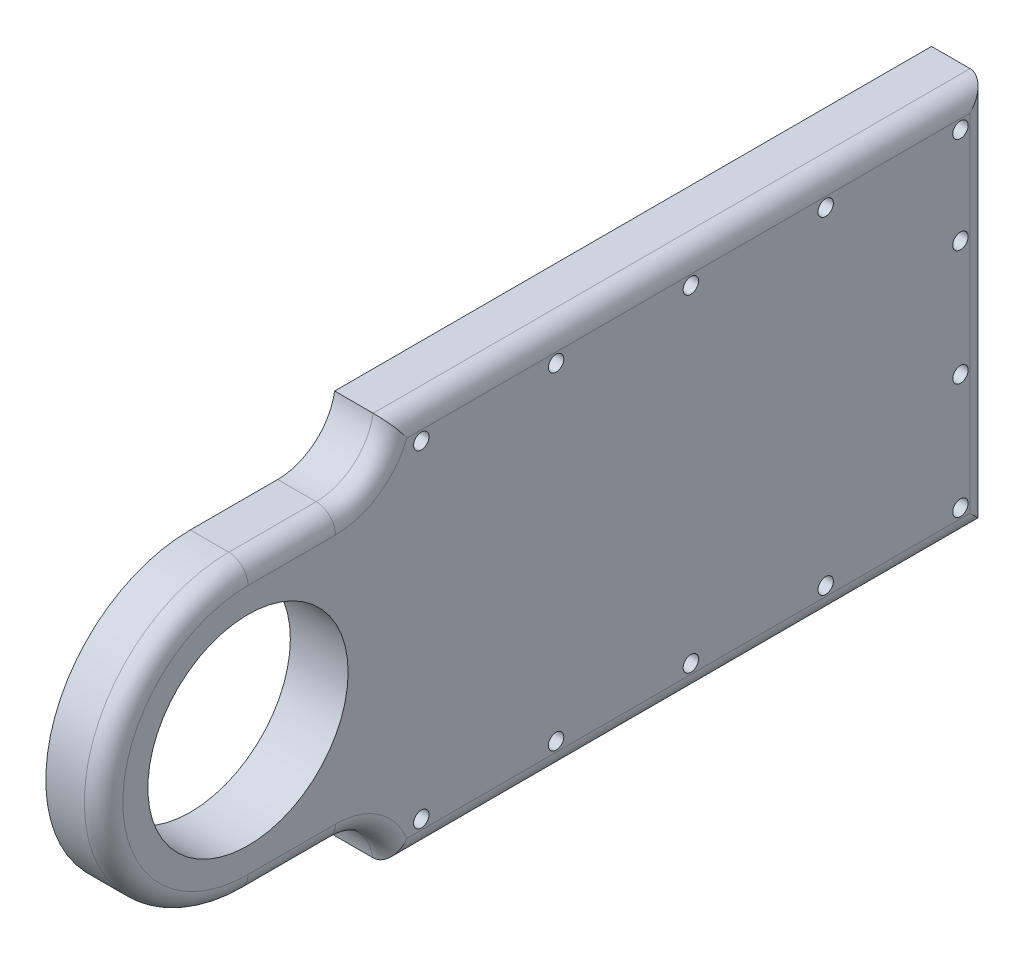
ISO-10303-21;
HEADER;
FILE_DESCRIPTION(('STEP AP214'),'2;1');
FILE_NAME('part.step','',(''),(''),'','','');
FILE_SCHEMA(('AUTOMOTIVE_DESIGN { 1 0 10303 214 1 1 1 1 }'));
ENDSEC;
DATA;
#1=APPLICATION_CONTEXT('core data for automotive mechanical design processes');
#2=APPLICATION_PROTOCOL_DEFINITION('international standard','automotive_design',2000,#1);
#3=PRODUCT_CONTEXT('',#1,'mechanical');
#4=PRODUCT('Part','Part','',(#3));
#5=PRODUCT_RELATED_PRODUCT_CATEGORY('part','',(#4));
#6=PRODUCT_DEFINITION_FORMATION('','',#4);
#7=PRODUCT_DEFINITION_CONTEXT('part definition',#1,'design');
#8=PRODUCT_DEFINITION('design','',#6,#7);
#9=PRODUCT_DEFINITION_SHAPE('','',#8);
#10=(LENGTH_UNIT() NAMED_UNIT(*) SI_UNIT(.MILLI.,.METRE.));
#11=(NAMED_UNIT(*) PLANE_ANGLE_UNIT() SI_UNIT($,.RADIAN.));
#12=(NAMED_UNIT(*) SI_UNIT($,.STERADIAN.) SOLID_ANGLE_UNIT());
#13=UNCERTAINTY_MEASURE_WITH_UNIT(LENGTH_MEASURE(1.E-05),#10,'distance_accuracy_value','');
#14=(GEOMETRIC_REPRESENTATION_CONTEXT(3) GLOBAL_UNCERTAINTY_ASSIGNED_CONTEXT((#13)) GLOBAL_UNIT_ASSIGNED_CONTEXT((#10,
#11,#12)) REPRESENTATION_CONTEXT('',''));
#15=CARTESIAN_POINT('',(0.,0.,0.));
#16=DIRECTION('',(0.,0.,1.));
#17=DIRECTION('',(1.,0.,0.));
#18=AXIS2_PLACEMENT_3D('',#15,#16,#17);
#19=CARTESIAN_POINT('',(0.,12.5,75.));
#20=DIRECTION('',(0.,1.,0.));
#21=DIRECTION('',(0.,0.,1.));
#22=AXIS2_PLACEMENT_3D('',#19,#20,#21);
#23=PLANE('',#22);
#24=DIRECTION('',(1.,0.,0.));
#25=VECTOR('',#24,1.);
#26=CARTESIAN_POINT('',(0.,12.5,14.790199457749));
#27=LINE('',#26,#25);
#28=CARTESIAN_POINT('',(0.,12.5,14.790199457749));
#29=VERTEX_POINT('',#28);
#30=CARTESIAN_POINT('',(10.,12.5,14.790199457749));
#31=VERTEX_POINT('',#30);
#32=EDGE_CURVE('E149',#29,#31,#27,.T.);
#33=ORIENTED_EDGE('',*,*,#32,.T.);
#34=DIRECTION('',(0.,0.,-1.));
#35=VECTOR('',#34,1.);
#36=CARTESIAN_POINT('',(10.,12.5,75.));
#37=LINE('',#36,#35);
#38=CARTESIAN_POINT('',(10.,12.5,37.5000036991946));
#39=VERTEX_POINT('',#38);
#40=EDGE_CURVE('E214',#31,#39,#37,.F.);
#41=ORIENTED_EDGE('',*,*,#40,.T.);
#42=DIRECTION('',(-1.,0.,0.));
#43=VECTOR('',#42,1.);
#44=CARTESIAN_POINT('',(15.,12.5,37.5000036991946));
#45=LINE('',#44,#43);
#46=CARTESIAN_POINT('',(0.,12.5,37.5));
#47=VERTEX_POINT('',#46);
#48=EDGE_CURVE('E441',#39,#47,#45,.T.);
#49=ORIENTED_EDGE('',*,*,#48,.T.);
#50=DIRECTION('',(0.,0.,-1.));
#51=VECTOR('',#50,1.);
#52=CARTESIAN_POINT('',(0.,12.5,75.));
#53=LINE('',#52,#51);
#54=EDGE_CURVE('E455',#47,#29,#53,.T.);
#55=ORIENTED_EDGE('',*,*,#54,.T.);
#56=EDGE_LOOP('',(#33,#41,#49,#55));
#57=FACE_BOUND('',#56,.T.);
#58=ADVANCED_FACE('F43',(#57),#23,.F.);
#59=CARTESIAN_POINT('',(15.,0.,0.));
#60=DIRECTION('',(0.,1.,0.));
#61=DIRECTION('',(0.,0.,1.));
#62=AXIS2_PLACEMENT_3D('',#59,#60,#61);
#63=PLANE('',#62);
#64=DIRECTION('',(-1.,0.,0.));
#65=VECTOR('',#64,1.);
#66=CARTESIAN_POINT('',(15.,0.,-155.));
#67=LINE('',#66,#65);
#68=CARTESIAN_POINT('',(10.,0.,-155.));
#69=VERTEX_POINT('',#68);
#70=CARTESIAN_POINT('',(0.,0.,-155.));
#71=VERTEX_POINT('',#70);
#72=EDGE_CURVE('E150',#69,#71,#67,.T.);
#73=ORIENTED_EDGE('',*,*,#72,.F.);
#74=DIRECTION('',(0.,0.,-1.));
#75=VECTOR('',#74,1.);
#76=CARTESIAN_POINT('',(10.,0.,0.));
#77=LINE('',#76,#75);
#78=CARTESIAN_POINT('',(10.,0.,0.));
#79=VERTEX_POINT('',#78);
#80=EDGE_CURVE('E144',#69,#79,#77,.F.);
#81=ORIENTED_EDGE('',*,*,#80,.T.);
#82=DIRECTION('',(-1.,0.,0.));
#83=VECTOR('',#82,1.);
#84=CARTESIAN_POINT('',(15.,0.,0.));
#85=LINE('',#84,#83);
#86=CARTESIAN_POINT('',(0.,0.,0.));
#87=VERTEX_POINT('',#86);
#88=EDGE_CURVE('E138',#79,#87,#85,.T.);
#89=ORIENTED_EDGE('',*,*,#88,.T.);
#90=DIRECTION('',(0.,0.,-1.));
#91=VECTOR('',#90,1.);
#92=CARTESIAN_POINT('',(0.,0.,0.));
#93=LINE('',#92,#91);
#94=EDGE_CURVE('E141',#87,#71,#93,.T.);
#95=ORIENTED_EDGE('',*,*,#94,.T.);
#96=EDGE_LOOP('',(#73,#81,#89,#95));
#97=FACE_BOUND('',#96,.T.);
#98=ADVANCED_FACE('F140',(#97),#63,.F.);
#99=CARTESIAN_POINT('',(15.,0.,-155.));
#100=DIRECTION('',(0.,0.,1.));
#101=DIRECTION('',(1.,0.,0.));
#102=AXIS2_PLACEMENT_3D('',#99,#100,#101);
#103=PLANE('',#102);
#104=DIRECTION('',(-1.,0.,0.));
#105=VECTOR('',#104,1.);
#106=CARTESIAN_POINT('',(15.,100.,-155.));
#107=LINE('',#106,#105);
#108=CARTESIAN_POINT('',(10.,100.,-155.));
#109=VERTEX_POINT('',#108);
#110=CARTESIAN_POINT('',(0.,100.,-155.));
#111=VERTEX_POINT('',#110);
#112=EDGE_CURVE('E469',#109,#111,#107,.T.);
#113=ORIENTED_EDGE('',*,*,#112,.F.);
#114=DIRECTION('',(0.,1.,0.));
#115=VECTOR('',#114,1.);
#116=CARTESIAN_POINT('',(10.,0.,-155.));
#117=LINE('',#116,#115);
#118=EDGE_CURVE('E58',#109,#69,#117,.F.);
#119=ORIENTED_EDGE('',*,*,#118,.T.);
#120=ORIENTED_EDGE('',*,*,#72,.T.);
#121=DIRECTION('',(0.,1.,0.));
#122=VECTOR('',#121,1.);
#123=CARTESIAN_POINT('',(0.,0.,-155.));
#124=LINE('',#123,#122);
#125=EDGE_CURVE('E161',#71,#111,#124,.T.);
#126=ORIENTED_EDGE('',*,*,#125,.T.);
#127=EDGE_LOOP('',(#113,#119,#120,#126));
#128=FACE_BOUND('',#127,.T.);
#129=ADVANCED_FACE('F281',(#128),#103,.F.);
#130=CARTESIAN_POINT('',(15.,100.,0.));
#131=DIRECTION('',(0.,-1.,0.));
#132=DIRECTION('',(0.,0.,-1.));
#133=AXIS2_PLACEMENT_3D('',#130,#131,#132);
#134=PLANE('',#133);
#135=DIRECTION('',(-1.,0.,0.));
#136=VECTOR('',#135,1.);
#137=CARTESIAN_POINT('',(15.,100.,0.));
#138=LINE('',#137,#136);
#139=CARTESIAN_POINT('',(10.,100.,0.));
#140=VERTEX_POINT('',#139);
#141=CARTESIAN_POINT('',(0.,100.,0.));
#142=VERTEX_POINT('',#141);
#143=EDGE_CURVE('E466',#140,#142,#138,.T.);
#144=ORIENTED_EDGE('',*,*,#143,.F.);
#145=DIRECTION('',(0.,0.,1.));
#146=VECTOR('',#145,1.);
#147=CARTESIAN_POINT('',(10.,100.,0.));
#148=LINE('',#147,#146);
#149=EDGE_CURVE('E11',#140,#109,#148,.F.);
#150=ORIENTED_EDGE('',*,*,#149,.T.);
#151=ORIENTED_EDGE('',*,*,#112,.T.);
#152=DIRECTION('',(0.,0.,1.));
#153=VECTOR('',#152,1.);
#154=CARTESIAN_POINT('',(0.,100.,0.));
#155=LINE('',#154,#153);
#156=EDGE_CURVE('E462',#111,#142,#155,.T.);
#157=ORIENTED_EDGE('',*,*,#156,.T.);
#158=EDGE_LOOP('',(#144,#150,#151,#157));
#159=FACE_BOUND('',#158,.T.);
#160=ADVANCED_FACE('F294',(#159),#134,.F.);
#161=CARTESIAN_POINT('',(15.,0.,0.));
#162=DIRECTION('',(-1.,0.,0.));
#163=DIRECTION('',(0.,0.,1.));
#164=AXIS2_PLACEMENT_3D('',#161,#162,#163);
#165=PLANE('',#164);
#166=DIRECTION('',(0.,0.,-1.));
#167=VECTOR('',#166,1.);
#168=CARTESIAN_POINT('',(15.,82.5,0.));
#169=LINE('',#168,#167);
#170=CARTESIAN_POINT('',(15.,82.5,14.790199457749));
#171=VERTEX_POINT('',#170);
#172=CARTESIAN_POINT('',(15.,82.5,37.5000036991946));
#173=VERTEX_POINT('',#172);
#174=EDGE_CURVE('E198',#171,#173,#169,.F.);
#175=ORIENTED_EDGE('',*,*,#174,.T.);
#176=CARTESIAN_POINT('',(15.,50.,37.5));
#177=DIRECTION('',(-1.,0.,0.));
#178=DIRECTION('',(0.,0.,1.));
#179=AXIS2_PLACEMENT_3D('',#176,#177,#178);
#180=CIRCLE('',#179,32.5000000000002);
#181=CARTESIAN_POINT('',(15.,17.5,37.5000036991946));
#182=VERTEX_POINT('',#181);
#183=EDGE_CURVE('E201',#173,#182,#180,.F.);
#184=ORIENTED_EDGE('',*,*,#183,.T.);
#185=DIRECTION('',(0.,0.,-1.));
#186=VECTOR('',#185,1.);
#187=CARTESIAN_POINT('',(15.,17.5,0.));
#188=LINE('',#187,#186);
#189=CARTESIAN_POINT('',(15.,17.5,14.790199457749));
#190=VERTEX_POINT('',#189);
#191=EDGE_CURVE('E195',#182,#190,#188,.T.);
#192=ORIENTED_EDGE('',*,*,#191,.T.);
#193=CARTESIAN_POINT('',(15.,-2.49999999999999,14.790199457749));
#194=DIRECTION('',(-1.,0.,0.));
#195=DIRECTION('',(0.,0.,1.));
#196=AXIS2_PLACEMENT_3D('',#193,#194,#195);
#197=CIRCLE('',#196,20.);
#198=CARTESIAN_POINT('',(15.,5.,-3.75029675999012));
#199=VERTEX_POINT('',#198);
#200=EDGE_CURVE('E188',#190,#199,#197,.T.);
#201=ORIENTED_EDGE('',*,*,#200,.T.);
#202=DIRECTION('',(0.,0.,-1.));
#203=VECTOR('',#202,1.);
#204=CARTESIAN_POINT('',(15.,5.,0.));
#205=LINE('',#204,#203);
#206=CARTESIAN_POINT('',(15.,5.,-150.));
#207=VERTEX_POINT('',#206);
#208=EDGE_CURVE('E185',#199,#207,#205,.T.);
#209=ORIENTED_EDGE('',*,*,#208,.T.);
#210=DIRECTION('',(0.,1.,0.));
#211=VECTOR('',#210,1.);
#212=CARTESIAN_POINT('',(15.,0.,-150.));
#213=LINE('',#212,#211);
#214=CARTESIAN_POINT('',(15.,95.,-150.));
#215=VERTEX_POINT('',#214);
#216=EDGE_CURVE('E182',#207,#215,#213,.T.);
#217=ORIENTED_EDGE('',*,*,#216,.T.);
#218=DIRECTION('',(0.,0.,1.));
#219=VECTOR('',#218,1.);
#220=CARTESIAN_POINT('',(15.,95.,0.));
#221=LINE('',#220,#219);
#222=CARTESIAN_POINT('',(15.,95.,-3.75029675999012));
#223=VERTEX_POINT('',#222);
#224=EDGE_CURVE('E175',#215,#223,#221,.T.);
#225=ORIENTED_EDGE('',*,*,#224,.T.);
#226=CARTESIAN_POINT('',(15.,102.5,14.790199457749));
#227=DIRECTION('',(-1.,0.,0.));
#228=DIRECTION('',(0.,0.,1.));
#229=AXIS2_PLACEMENT_3D('',#226,#227,#228);
#230=CIRCLE('',#229,20.);
#231=EDGE_CURVE('E191',#223,#171,#230,.T.);
#232=ORIENTED_EDGE('',*,*,#231,.T.);
#233=EDGE_LOOP('',(#175,#184,#192,#201,#209,#217,#225,#232));
#234=FACE_BOUND('',#233,.T.);
#235=CARTESIAN_POINT('',(15.,92.5,-112.5));
#236=DIRECTION('',(-1.,0.,0.));
#237=DIRECTION('',(0.,0.,1.));
#238=AXIS2_PLACEMENT_3D('',#235,#236,#237);
#239=CIRCLE('',#238,2.);
#240=CARTESIAN_POINT('',(15.,92.5,-110.5));
#241=VERTEX_POINT('',#240);
#242=EDGE_CURVE('E392',#241,#241,#239,.T.);
#243=ORIENTED_EDGE('',*,*,#242,.T.);
#244=EDGE_LOOP('',(#243));
#245=FACE_BOUND('',#244,.T.);
#246=CARTESIAN_POINT('',(15.,67.5,-147.5));
#247=DIRECTION('',(-1.,0.,0.));
#248=DIRECTION('',(0.,0.,-1.));
#249=AXIS2_PLACEMENT_3D('',#246,#247,#248);
#250=CIRCLE('',#249,2.);
#251=CARTESIAN_POINT('',(15.,67.5,-149.5));
#252=VERTEX_POINT('',#251);
#253=EDGE_CURVE('E384',#252,#252,#250,.T.);
#254=ORIENTED_EDGE('',*,*,#253,.T.);
#255=EDGE_LOOP('',(#254));
#256=FACE_BOUND('',#255,.T.);
#257=CARTESIAN_POINT('',(15.,37.5,-147.5));
#258=DIRECTION('',(-1.,0.,0.));
#259=DIRECTION('',(0.,0.,-1.));
#260=AXIS2_PLACEMENT_3D('',#257,#258,#259);
#261=CIRCLE('',#260,2.);
#262=CARTESIAN_POINT('',(15.,37.5,-149.5));
#263=VERTEX_POINT('',#262);
#264=EDGE_CURVE('E376',#263,#263,#261,.T.);
#265=ORIENTED_EDGE('',*,*,#264,.T.);
#266=EDGE_LOOP('',(#265));
#267=FACE_BOUND('',#266,.T.);
#268=CARTESIAN_POINT('',(15.,7.50000000000001,-147.5));
#269=DIRECTION('',(-1.,0.,0.));
#270=DIRECTION('',(0.,0.,-1.));
#271=AXIS2_PLACEMENT_3D('',#268,#269,#270);
#272=CIRCLE('',#271,2.);
#273=CARTESIAN_POINT('',(15.,7.50000000000001,-149.5));
#274=VERTEX_POINT('',#273);
#275=EDGE_CURVE('E367',#274,#274,#272,.T.);
#276=ORIENTED_EDGE('',*,*,#275,.T.);
#277=EDGE_LOOP('',(#276));
#278=FACE_BOUND('',#277,.T.);
#279=CARTESIAN_POINT('',(15.,7.50000000000001,-112.5));
#280=DIRECTION('',(-1.,0.,0.));
#281=DIRECTION('',(0.,0.,-1.));
#282=AXIS2_PLACEMENT_3D('',#279,#280,#281);
#283=CIRCLE('',#282,2.);
#284=CARTESIAN_POINT('',(15.,7.50000000000001,-114.5));
#285=VERTEX_POINT('',#284);
#286=EDGE_CURVE('E426',#285,#285,#283,.T.);
#287=ORIENTED_EDGE('',*,*,#286,.T.);
#288=EDGE_LOOP('',(#287));
#289=FACE_BOUND('',#288,.T.);
#290=CARTESIAN_POINT('',(15.,7.50000000000001,-77.5));
#291=DIRECTION('',(-1.,0.,0.));
#292=DIRECTION('',(0.,0.,-1.));
#293=AXIS2_PLACEMENT_3D('',#290,#291,#292);
#294=CIRCLE('',#293,2.);
#295=CARTESIAN_POINT('',(15.,7.50000000000001,-79.5));
#296=VERTEX_POINT('',#295);
#297=EDGE_CURVE('E418',#296,#296,#294,.T.);
#298=ORIENTED_EDGE('',*,*,#297,.T.);
#299=EDGE_LOOP('',(#298));
#300=FACE_BOUND('',#299,.T.);
#301=CARTESIAN_POINT('',(15.,7.50000000000001,-42.5));
#302=DIRECTION('',(-1.,0.,0.));
#303=DIRECTION('',(0.,0.,-1.));
#304=AXIS2_PLACEMENT_3D('',#301,#302,#303);
#305=CIRCLE('',#304,2.);
#306=CARTESIAN_POINT('',(15.,7.50000000000001,-44.5));
#307=VERTEX_POINT('',#306);
#308=EDGE_CURVE('E410',#307,#307,#305,.T.);
#309=ORIENTED_EDGE('',*,*,#308,.T.);
#310=EDGE_LOOP('',(#309));
#311=FACE_BOUND('',#310,.T.);
#312=CARTESIAN_POINT('',(15.,7.50000000000001,-7.50000000000009));
#313=DIRECTION('',(-1.,0.,0.));
#314=DIRECTION('',(0.,0.,-1.));
#315=AXIS2_PLACEMENT_3D('',#312,#313,#314);
#316=CIRCLE('',#315,2.);
#317=CARTESIAN_POINT('',(15.,7.50000000000001,-9.50000000000009));
#318=VERTEX_POINT('',#317);
#319=EDGE_CURVE('E401',#318,#318,#316,.T.);
#320=ORIENTED_EDGE('',*,*,#319,.T.);
#321=EDGE_LOOP('',(#320));
#322=FACE_BOUND('',#321,.T.);
#323=CARTESIAN_POINT('',(15.,92.5,-77.5));
#324=DIRECTION('',(-1.,0.,0.));
#325=DIRECTION('',(0.,0.,1.));
#326=AXIS2_PLACEMENT_3D('',#323,#324,#325);
#327=CIRCLE('',#326,2.);
#328=CARTESIAN_POINT('',(15.,92.5,-75.5));
#329=VERTEX_POINT('',#328);
#330=EDGE_CURVE('E400',#329,#329,#327,.T.);
#331=ORIENTED_EDGE('',*,*,#330,.T.);
#332=EDGE_LOOP('',(#331));
#333=FACE_BOUND('',#332,.T.);
#334=CARTESIAN_POINT('',(15.,92.5,-42.5));
#335=DIRECTION('',(-1.,0.,0.));
#336=DIRECTION('',(0.,0.,1.));
#337=AXIS2_PLACEMENT_3D('',#334,#335,#336);
#338=CIRCLE('',#337,2.);
#339=CARTESIAN_POINT('',(15.,92.5,-40.5));
#340=VERTEX_POINT('',#339);
#341=EDGE_CURVE('E537',#340,#340,#338,.T.);
#342=ORIENTED_EDGE('',*,*,#341,.T.);
#343=EDGE_LOOP('',(#342));
#344=FACE_BOUND('',#343,.T.);
#345=CARTESIAN_POINT('',(15.,92.5,-7.49999999999998));
#346=DIRECTION('',(-1.,0.,0.));
#347=DIRECTION('',(0.,0.,1.));
#348=AXIS2_PLACEMENT_3D('',#345,#346,#347);
#349=CIRCLE('',#348,2.);
#350=CARTESIAN_POINT('',(15.,92.5,-5.49999999999998));
#351=VERTEX_POINT('',#350);
#352=EDGE_CURVE('E357',#351,#351,#349,.T.);
#353=ORIENTED_EDGE('',*,*,#352,.T.);
#354=EDGE_LOOP('',(#353));
#355=FACE_BOUND('',#354,.T.);
#356=CARTESIAN_POINT('',(15.,92.5,-147.5));
#357=DIRECTION('',(-1.,0.,0.));
#358=DIRECTION('',(0.,0.,1.));
#359=AXIS2_PLACEMENT_3D('',#356,#357,#358);
#360=CIRCLE('',#359,2.);
#361=CARTESIAN_POINT('',(15.,92.5,-145.5));
#362=VERTEX_POINT('',#361);
#363=EDGE_CURVE('E433',#362,#362,#360,.T.);
#364=ORIENTED_EDGE('',*,*,#363,.T.);
#365=EDGE_LOOP('',(#364));
#366=FACE_BOUND('',#365,.T.);
#367=CARTESIAN_POINT('',(15.,50.,37.5));
#368=DIRECTION('',(1.,0.,0.));
#369=DIRECTION('',(0.,0.,-1.));
#370=AXIS2_PLACEMENT_3D('',#367,#368,#369);
#371=CIRCLE('',#370,26.);
#372=CARTESIAN_POINT('',(15.,50.,11.5));
#373=VERTEX_POINT('',#372);
#374=EDGE_CURVE('E450',#373,#373,#371,.T.);
#375=ORIENTED_EDGE('',*,*,#374,.F.);
#376=EDGE_LOOP('',(#375));
#377=FACE_BOUND('',#376,.T.);
#378=ADVANCED_FACE('F291',(#234,#245,#256,#267,#278,#289,#300,#311,#322,#333,#344,#355,#366,
#377),#165,.F.);
#379=CARTESIAN_POINT('',(0.,0.,0.));
#380=DIRECTION('',(-1.,0.,0.));
#381=DIRECTION('',(0.,0.,1.));
#382=AXIS2_PLACEMENT_3D('',#379,#380,#381);
#383=PLANE('',#382);
#384=CARTESIAN_POINT('',(0.,92.5,-112.5));
#385=DIRECTION('',(-1.,0.,0.));
#386=DIRECTION('',(0.,0.,1.));
#387=AXIS2_PLACEMENT_3D('',#384,#385,#386);
#388=CIRCLE('',#387,2.);
#389=CARTESIAN_POINT('',(0.,92.5,-110.5));
#390=VERTEX_POINT('',#389);
#391=EDGE_CURVE('E396',#390,#390,#388,.T.);
#392=ORIENTED_EDGE('',*,*,#391,.F.);
#393=EDGE_LOOP('',(#392));
#394=FACE_BOUND('',#393,.T.);
#395=CARTESIAN_POINT('',(0.,67.5,-147.5));
#396=DIRECTION('',(-1.,0.,0.));
#397=DIRECTION('',(0.,0.,-1.));
#398=AXIS2_PLACEMENT_3D('',#395,#396,#397);
#399=CIRCLE('',#398,2.);
#400=CARTESIAN_POINT('',(0.,67.5,-149.5));
#401=VERTEX_POINT('',#400);
#402=EDGE_CURVE('E388',#401,#401,#399,.T.);
#403=ORIENTED_EDGE('',*,*,#402,.F.);
#404=EDGE_LOOP('',(#403));
#405=FACE_BOUND('',#404,.T.);
#406=CARTESIAN_POINT('',(0.,37.5,-147.5));
#407=DIRECTION('',(-1.,0.,0.));
#408=DIRECTION('',(0.,0.,-1.));
#409=AXIS2_PLACEMENT_3D('',#406,#407,#408);
#410=CIRCLE('',#409,2.);
#411=CARTESIAN_POINT('',(0.,37.5,-149.5));
#412=VERTEX_POINT('',#411);
#413=EDGE_CURVE('E380',#412,#412,#410,.T.);
#414=ORIENTED_EDGE('',*,*,#413,.F.);
#415=EDGE_LOOP('',(#414));
#416=FACE_BOUND('',#415,.T.);
#417=CARTESIAN_POINT('',(0.,7.50000000000001,-147.5));
#418=DIRECTION('',(-1.,0.,0.));
#419=DIRECTION('',(0.,0.,-1.));
#420=AXIS2_PLACEMENT_3D('',#417,#418,#419);
#421=CIRCLE('',#420,2.);
#422=CARTESIAN_POINT('',(0.,7.50000000000001,-149.5));
#423=VERTEX_POINT('',#422);
#424=EDGE_CURVE('E372',#423,#423,#421,.T.);
#425=ORIENTED_EDGE('',*,*,#424,.F.);
#426=EDGE_LOOP('',(#425));
#427=FACE_BOUND('',#426,.T.);
#428=CARTESIAN_POINT('',(0.,7.50000000000001,-112.5));
#429=DIRECTION('',(-1.,0.,0.));
#430=DIRECTION('',(0.,0.,-1.));
#431=AXIS2_PLACEMENT_3D('',#428,#429,#430);
#432=CIRCLE('',#431,2.);
#433=CARTESIAN_POINT('',(0.,7.50000000000001,-114.5));
#434=VERTEX_POINT('',#433);
#435=EDGE_CURVE('E371',#434,#434,#432,.T.);
#436=ORIENTED_EDGE('',*,*,#435,.F.);
#437=EDGE_LOOP('',(#436));
#438=FACE_BOUND('',#437,.T.);
#439=CARTESIAN_POINT('',(0.,7.50000000000001,-77.5));
#440=DIRECTION('',(-1.,0.,0.));
#441=DIRECTION('',(0.,0.,-1.));
#442=AXIS2_PLACEMENT_3D('',#439,#440,#441);
#443=CIRCLE('',#442,2.);
#444=CARTESIAN_POINT('',(0.,7.50000000000001,-79.5));
#445=VERTEX_POINT('',#444);
#446=EDGE_CURVE('E422',#445,#445,#443,.T.);
#447=ORIENTED_EDGE('',*,*,#446,.F.);
#448=EDGE_LOOP('',(#447));
#449=FACE_BOUND('',#448,.T.);
#450=CARTESIAN_POINT('',(0.,7.50000000000001,-42.5));
#451=DIRECTION('',(-1.,0.,0.));
#452=DIRECTION('',(0.,0.,-1.));
#453=AXIS2_PLACEMENT_3D('',#450,#451,#452);
#454=CIRCLE('',#453,2.);
#455=CARTESIAN_POINT('',(0.,7.50000000000001,-44.5));
#456=VERTEX_POINT('',#455);
#457=EDGE_CURVE('E414',#456,#456,#454,.T.);
#458=ORIENTED_EDGE('',*,*,#457,.F.);
#459=EDGE_LOOP('',(#458));
#460=FACE_BOUND('',#459,.T.);
#461=CARTESIAN_POINT('',(0.,7.50000000000001,-7.50000000000009));
#462=DIRECTION('',(-1.,0.,0.));
#463=DIRECTION('',(0.,0.,-1.));
#464=AXIS2_PLACEMENT_3D('',#461,#462,#463);
#465=CIRCLE('',#464,2.);
#466=CARTESIAN_POINT('',(0.,7.50000000000001,-9.50000000000009));
#467=VERTEX_POINT('',#466);
#468=EDGE_CURVE('E406',#467,#467,#465,.T.);
#469=ORIENTED_EDGE('',*,*,#468,.F.);
#470=EDGE_LOOP('',(#469));
#471=FACE_BOUND('',#470,.T.);
#472=CARTESIAN_POINT('',(0.,92.5,-77.5));
#473=DIRECTION('',(-1.,0.,0.));
#474=DIRECTION('',(0.,0.,1.));
#475=AXIS2_PLACEMENT_3D('',#472,#473,#474);
#476=CIRCLE('',#475,2.);
#477=CARTESIAN_POINT('',(0.,92.5,-75.5));
#478=VERTEX_POINT('',#477);
#479=EDGE_CURVE('E534',#478,#478,#476,.T.);
#480=ORIENTED_EDGE('',*,*,#479,.F.);
#481=EDGE_LOOP('',(#480));
#482=FACE_BOUND('',#481,.T.);
#483=CARTESIAN_POINT('',(0.,92.5,-42.5));
#484=DIRECTION('',(-1.,0.,0.));
#485=DIRECTION('',(0.,0.,1.));
#486=AXIS2_PLACEMENT_3D('',#483,#484,#485);
#487=CIRCLE('',#486,2.);
#488=CARTESIAN_POINT('',(0.,92.5,-40.5));
#489=VERTEX_POINT('',#488);
#490=EDGE_CURVE('E363',#489,#489,#487,.T.);
#491=ORIENTED_EDGE('',*,*,#490,.F.);
#492=EDGE_LOOP('',(#491));
#493=FACE_BOUND('',#492,.T.);
#494=CARTESIAN_POINT('',(0.,92.5,-7.49999999999998));
#495=DIRECTION('',(-1.,0.,0.));
#496=DIRECTION('',(0.,0.,1.));
#497=AXIS2_PLACEMENT_3D('',#494,#495,#496);
#498=CIRCLE('',#497,2.);
#499=CARTESIAN_POINT('',(0.,92.5,-5.49999999999998));
#500=VERTEX_POINT('',#499);
#501=EDGE_CURVE('E352',#500,#500,#498,.T.);
#502=ORIENTED_EDGE('',*,*,#501,.F.);
#503=EDGE_LOOP('',(#502));
#504=FACE_BOUND('',#503,.T.);
#505=CARTESIAN_POINT('',(0.,92.5,-147.5));
#506=DIRECTION('',(-1.,0.,0.));
#507=DIRECTION('',(0.,0.,1.));
#508=AXIS2_PLACEMENT_3D('',#505,#506,#507);
#509=CIRCLE('',#508,2.);
#510=CARTESIAN_POINT('',(0.,92.5,-145.5));
#511=VERTEX_POINT('',#510);
#512=EDGE_CURVE('E405',#511,#511,#509,.T.);
#513=ORIENTED_EDGE('',*,*,#512,.F.);
#514=EDGE_LOOP('',(#513));
#515=FACE_BOUND('',#514,.T.);
#516=CARTESIAN_POINT('',(0.,50.,37.5));
#517=DIRECTION('',(-1.,0.,0.));
#518=DIRECTION('',(0.,0.,1.));
#519=AXIS2_PLACEMENT_3D('',#516,#517,#518);
#520=CIRCLE('',#519,37.5000000000002);
#521=CARTESIAN_POINT('',(0.,87.5,37.5));
#522=VERTEX_POINT('',#521);
#523=EDGE_CURVE('E444',#522,#47,#520,.F.);
#524=ORIENTED_EDGE('',*,*,#523,.F.);
#525=DIRECTION('',(0.,0.,-1.));
#526=VECTOR('',#525,1.);
#527=CARTESIAN_POINT('',(0.,87.5,75.));
#528=LINE('',#527,#526);
#529=CARTESIAN_POINT('',(0.,87.5,14.790199457749));
#530=VERTEX_POINT('',#529);
#531=EDGE_CURVE('E163',#522,#530,#528,.T.);
#532=ORIENTED_EDGE('',*,*,#531,.T.);
#533=CARTESIAN_POINT('',(0.,102.5,14.790199457749));
#534=DIRECTION('',(-1.,0.,0.));
#535=DIRECTION('',(0.,0.,1.));
#536=AXIS2_PLACEMENT_3D('',#533,#534,#535);
#537=CIRCLE('',#536,15.);
#538=EDGE_CURVE('E169',#530,#142,#537,.F.);
#539=ORIENTED_EDGE('',*,*,#538,.T.);
#540=ORIENTED_EDGE('',*,*,#156,.F.);
#541=ORIENTED_EDGE('',*,*,#125,.F.);
#542=ORIENTED_EDGE('',*,*,#94,.F.);
#543=CARTESIAN_POINT('',(0.,-2.49999999999999,14.790199457749));
#544=DIRECTION('',(-1.,0.,0.));
#545=DIRECTION('',(0.,0.,1.));
#546=AXIS2_PLACEMENT_3D('',#543,#544,#545);
#547=CIRCLE('',#546,15.);
#548=EDGE_CURVE('E157',#87,#29,#547,.F.);
#549=ORIENTED_EDGE('',*,*,#548,.T.);
#550=ORIENTED_EDGE('',*,*,#54,.F.);
#551=EDGE_LOOP('',(#524,#532,#539,#540,#541,#542,#549,#550));
#552=FACE_BOUND('',#551,.T.);
#553=CARTESIAN_POINT('',(0.,50.,37.5));
#554=DIRECTION('',(-1.,0.,0.));
#555=DIRECTION('',(0.,0.,1.));
#556=AXIS2_PLACEMENT_3D('',#553,#554,#555);
#557=CIRCLE('',#556,26.);
#558=CARTESIAN_POINT('',(0.,50.,63.5));
#559=VERTEX_POINT('',#558);
#560=EDGE_CURVE('E454',#559,#559,#557,.T.);
#561=ORIENTED_EDGE('',*,*,#560,.F.);
#562=EDGE_LOOP('',(#561));
#563=FACE_BOUND('',#562,.T.);
#564=ADVANCED_FACE('F154',(#394,#405,#416,#427,#438,#449,#460,#471,#482,#493,#504,#515,#552,
#563),#383,.T.);
#565=CARTESIAN_POINT('',(0.,87.5,75.));
#566=DIRECTION('',(0.,-1.,0.));
#567=DIRECTION('',(1.,0.,0.));
#568=AXIS2_PLACEMENT_3D('',#565,#566,#567);
#569=PLANE('',#568);
#570=DIRECTION('',(-1.,0.,0.));
#571=VECTOR('',#570,1.);
#572=CARTESIAN_POINT('',(15.,87.5,37.5000036991946));
#573=LINE('',#572,#571);
#574=CARTESIAN_POINT('',(10.,87.5,37.5000036991946));
#575=VERTEX_POINT('',#574);
#576=EDGE_CURVE('E437',#575,#522,#573,.T.);
#577=ORIENTED_EDGE('',*,*,#576,.F.);
#578=DIRECTION('',(0.,0.,-1.));
#579=VECTOR('',#578,1.);
#580=CARTESIAN_POINT('',(9.99999999999999,87.5,75.));
#581=LINE('',#580,#579);
#582=CARTESIAN_POINT('',(9.99999999999999,87.5,14.790199457749));
#583=VERTEX_POINT('',#582);
#584=EDGE_CURVE('E208',#575,#583,#581,.T.);
#585=ORIENTED_EDGE('',*,*,#584,.T.);
#586=DIRECTION('',(-1.,0.,0.));
#587=VECTOR('',#586,1.);
#588=CARTESIAN_POINT('',(0.,87.5,14.790199457749));
#589=LINE('',#588,#587);
#590=EDGE_CURVE('E170',#583,#530,#589,.T.);
#591=ORIENTED_EDGE('',*,*,#590,.T.);
#592=ORIENTED_EDGE('',*,*,#531,.F.);
#593=EDGE_LOOP('',(#577,#585,#591,#592));
#594=FACE_BOUND('',#593,.T.);
#595=ADVANCED_FACE('F287',(#594),#569,.F.);
#596=CARTESIAN_POINT('',(-60.,50.,37.5));
#597=DIRECTION('',(1.,0.,0.));
#598=DIRECTION('',(0.,0.,-1.));
#599=AXIS2_PLACEMENT_3D('',#596,#597,#598);
#600=CYLINDRICAL_SURFACE('',#599,26.);
#601=ORIENTED_EDGE('',*,*,#560,.T.);
#602=EDGE_LOOP('',(#601));
#603=FACE_BOUND('',#602,.T.);
#604=ORIENTED_EDGE('',*,*,#374,.T.);
#605=EDGE_LOOP('',(#604));
#606=FACE_BOUND('',#605,.T.);
#607=ADVANCED_FACE('F285',(#603,#606),#600,.F.);
#608=CARTESIAN_POINT('',(15.,50.,37.5));
#609=DIRECTION('',(-1.,0.,0.));
#610=DIRECTION('',(0.,0.,1.));
#611=AXIS2_PLACEMENT_3D('',#608,#609,#610);
#612=CYLINDRICAL_SURFACE('',#611,37.5000000000002);
#613=ORIENTED_EDGE('',*,*,#48,.F.);
#614=CARTESIAN_POINT('',(10.,50.,37.5));
#615=DIRECTION('',(-1.,0.,0.));
#616=DIRECTION('',(0.,0.,1.));
#617=AXIS2_PLACEMENT_3D('',#614,#615,#616);
#618=CIRCLE('',#617,37.5000000000002);
#619=EDGE_CURVE('E217',#39,#575,#618,.T.);
#620=ORIENTED_EDGE('',*,*,#619,.T.);
#621=ORIENTED_EDGE('',*,*,#576,.T.);
#622=ORIENTED_EDGE('',*,*,#523,.T.);
#623=EDGE_LOOP('',(#613,#620,#621,#622));
#624=FACE_BOUND('',#623,.T.);
#625=ADVANCED_FACE('F305',(#624),#612,.T.);
#626=CARTESIAN_POINT('',(15.,-2.49999999999999,14.790199457749));
#627=DIRECTION('',(1.,0.,0.));
#628=DIRECTION('',(0.,0.,-1.));
#629=AXIS2_PLACEMENT_3D('',#626,#627,#628);
#630=CYLINDRICAL_SURFACE('',#629,15.);
#631=ORIENTED_EDGE('',*,*,#88,.F.);
#632=CARTESIAN_POINT('',(10.,-2.49999999999999,14.790199457749));
#633=DIRECTION('',(-1.,0.,0.));
#634=DIRECTION('',(0.,0.,1.));
#635=AXIS2_PLACEMENT_3D('',#632,#633,#634);
#636=CIRCLE('',#635,15.);
#637=EDGE_CURVE('E211',#79,#31,#636,.F.);
#638=ORIENTED_EDGE('',*,*,#637,.T.);
#639=ORIENTED_EDGE('',*,*,#32,.F.);
#640=ORIENTED_EDGE('',*,*,#548,.F.);
#641=EDGE_LOOP('',(#631,#638,#639,#640));
#642=FACE_BOUND('',#641,.T.);
#643=ADVANCED_FACE('F166',(#642),#630,.F.);
#644=CARTESIAN_POINT('',(15.,102.5,14.790199457749));
#645=DIRECTION('',(-1.,0.,0.));
#646=DIRECTION('',(0.,0.,1.));
#647=AXIS2_PLACEMENT_3D('',#644,#645,#646);
#648=CYLINDRICAL_SURFACE('',#647,15.);
#649=ORIENTED_EDGE('',*,*,#590,.F.);
#650=CARTESIAN_POINT('',(10.,102.5,14.790199457749));
#651=DIRECTION('',(-1.,0.,0.));
#652=DIRECTION('',(0.,0.,1.));
#653=AXIS2_PLACEMENT_3D('',#650,#651,#652);
#654=CIRCLE('',#653,15.);
#655=EDGE_CURVE('E204',#583,#140,#654,.F.);
#656=ORIENTED_EDGE('',*,*,#655,.T.);
#657=ORIENTED_EDGE('',*,*,#143,.T.);
#658=ORIENTED_EDGE('',*,*,#538,.F.);
#659=EDGE_LOOP('',(#649,#656,#657,#658));
#660=FACE_BOUND('',#659,.T.);
#661=ADVANCED_FACE('F304',(#660),#648,.F.);
#662=CARTESIAN_POINT('',(15.,92.5,-147.5));
#663=DIRECTION('',(-1.,0.,0.));
#664=DIRECTION('',(0.,0.,1.));
#665=AXIS2_PLACEMENT_3D('',#662,#663,#664);
#666=CYLINDRICAL_SURFACE('',#665,2.);
#667=ORIENTED_EDGE('',*,*,#363,.F.);
#668=EDGE_LOOP('',(#667));
#669=FACE_BOUND('',#668,.T.);
#670=ORIENTED_EDGE('',*,*,#512,.T.);
#671=EDGE_LOOP('',(#670));
#672=FACE_BOUND('',#671,.T.);
#673=ADVANCED_FACE('F307',(#669,#672),#666,.F.);
#674=CARTESIAN_POINT('',(15.,92.5,-7.49999999999998));
#675=DIRECTION('',(-1.,0.,0.));
#676=DIRECTION('',(0.,0.,1.));
#677=AXIS2_PLACEMENT_3D('',#674,#675,#676);
#678=CYLINDRICAL_SURFACE('',#677,2.);
#679=ORIENTED_EDGE('',*,*,#352,.F.);
#680=EDGE_LOOP('',(#679));
#681=FACE_BOUND('',#680,.T.);
#682=ORIENTED_EDGE('',*,*,#501,.T.);
#683=EDGE_LOOP('',(#682));
#684=FACE_BOUND('',#683,.T.);
#685=ADVANCED_FACE('F312',(#681,#684),#678,.F.);
#686=CARTESIAN_POINT('',(15.,92.5,-42.5));
#687=DIRECTION('',(-1.,0.,0.));
#688=DIRECTION('',(0.,0.,1.));
#689=AXIS2_PLACEMENT_3D('',#686,#687,#688);
#690=CYLINDRICAL_SURFACE('',#689,2.);
#691=ORIENTED_EDGE('',*,*,#341,.F.);
#692=EDGE_LOOP('',(#691));
#693=FACE_BOUND('',#692,.T.);
#694=ORIENTED_EDGE('',*,*,#490,.T.);
#695=EDGE_LOOP('',(#694));
#696=FACE_BOUND('',#695,.T.);
#697=ADVANCED_FACE('F520',(#693,#696),#690,.F.);
#698=CARTESIAN_POINT('',(15.,92.5,-77.5));
#699=DIRECTION('',(-1.,0.,0.));
#700=DIRECTION('',(0.,0.,1.));
#701=AXIS2_PLACEMENT_3D('',#698,#699,#700);
#702=CYLINDRICAL_SURFACE('',#701,2.);
#703=ORIENTED_EDGE('',*,*,#330,.F.);
#704=EDGE_LOOP('',(#703));
#705=FACE_BOUND('',#704,.T.);
#706=ORIENTED_EDGE('',*,*,#479,.T.);
#707=EDGE_LOOP('',(#706));
#708=FACE_BOUND('',#707,.T.);
#709=ADVANCED_FACE('F505',(#705,#708),#702,.F.);
#710=CARTESIAN_POINT('',(15.,7.50000000000001,-7.50000000000009));
#711=DIRECTION('',(-1.,0.,0.));
#712=DIRECTION('',(0.,0.,1.));
#713=AXIS2_PLACEMENT_3D('',#710,#711,#712);
#714=CYLINDRICAL_SURFACE('',#713,2.);
#715=ORIENTED_EDGE('',*,*,#319,.F.);
#716=EDGE_LOOP('',(#715));
#717=FACE_BOUND('',#716,.T.);
#718=ORIENTED_EDGE('',*,*,#468,.T.);
#719=EDGE_LOOP('',(#718));
#720=FACE_BOUND('',#719,.T.);
#721=ADVANCED_FACE('F502',(#717,#720),#714,.F.);
#722=CARTESIAN_POINT('',(15.,7.50000000000001,-42.5));
#723=DIRECTION('',(-1.,0.,0.));
#724=DIRECTION('',(0.,0.,1.));
#725=AXIS2_PLACEMENT_3D('',#722,#723,#724);
#726=CYLINDRICAL_SURFACE('',#725,2.);
#727=ORIENTED_EDGE('',*,*,#308,.F.);
#728=EDGE_LOOP('',(#727));
#729=FACE_BOUND('',#728,.T.);
#730=ORIENTED_EDGE('',*,*,#457,.T.);
#731=EDGE_LOOP('',(#730));
#732=FACE_BOUND('',#731,.T.);
#733=ADVANCED_FACE('F498',(#729,#732),#726,.F.);
#734=CARTESIAN_POINT('',(15.,7.50000000000001,-77.5));
#735=DIRECTION('',(-1.,0.,0.));
#736=DIRECTION('',(0.,0.,1.));
#737=AXIS2_PLACEMENT_3D('',#734,#735,#736);
#738=CYLINDRICAL_SURFACE('',#737,2.);
#739=ORIENTED_EDGE('',*,*,#297,.F.);
#740=EDGE_LOOP('',(#739));
#741=FACE_BOUND('',#740,.T.);
#742=ORIENTED_EDGE('',*,*,#446,.T.);
#743=EDGE_LOOP('',(#742));
#744=FACE_BOUND('',#743,.T.);
#745=ADVANCED_FACE('F494',(#741,#744),#738,.F.);
#746=CARTESIAN_POINT('',(15.,7.50000000000001,-112.5));
#747=DIRECTION('',(-1.,0.,0.));
#748=DIRECTION('',(0.,0.,1.));
#749=AXIS2_PLACEMENT_3D('',#746,#747,#748);
#750=CYLINDRICAL_SURFACE('',#749,2.);
#751=ORIENTED_EDGE('',*,*,#286,.F.);
#752=EDGE_LOOP('',(#751));
#753=FACE_BOUND('',#752,.T.);
#754=ORIENTED_EDGE('',*,*,#435,.T.);
#755=EDGE_LOOP('',(#754));
#756=FACE_BOUND('',#755,.T.);
#757=ADVANCED_FACE('F490',(#753,#756),#750,.F.);
#758=CARTESIAN_POINT('',(15.,7.50000000000001,-147.5));
#759=DIRECTION('',(-1.,0.,0.));
#760=DIRECTION('',(0.,0.,1.));
#761=AXIS2_PLACEMENT_3D('',#758,#759,#760);
#762=CYLINDRICAL_SURFACE('',#761,2.);
#763=ORIENTED_EDGE('',*,*,#275,.F.);
#764=EDGE_LOOP('',(#763));
#765=FACE_BOUND('',#764,.T.);
#766=ORIENTED_EDGE('',*,*,#424,.T.);
#767=EDGE_LOOP('',(#766));
#768=FACE_BOUND('',#767,.T.);
#769=ADVANCED_FACE('F493',(#765,#768),#762,.F.);
#770=CARTESIAN_POINT('',(15.,37.5,-147.5));
#771=DIRECTION('',(-1.,0.,0.));
#772=DIRECTION('',(0.,0.,1.));
#773=AXIS2_PLACEMENT_3D('',#770,#771,#772);
#774=CYLINDRICAL_SURFACE('',#773,2.);
#775=ORIENTED_EDGE('',*,*,#264,.F.);
#776=EDGE_LOOP('',(#775));
#777=FACE_BOUND('',#776,.T.);
#778=ORIENTED_EDGE('',*,*,#413,.T.);
#779=EDGE_LOOP('',(#778));
#780=FACE_BOUND('',#779,.T.);
#781=ADVANCED_FACE('F510',(#777,#780),#774,.F.);
#782=CARTESIAN_POINT('',(15.,67.5,-147.5));
#783=DIRECTION('',(-1.,0.,0.));
#784=DIRECTION('',(0.,0.,1.));
#785=AXIS2_PLACEMENT_3D('',#782,#783,#784);
#786=CYLINDRICAL_SURFACE('',#785,2.);
#787=ORIENTED_EDGE('',*,*,#253,.F.);
#788=EDGE_LOOP('',(#787));
#789=FACE_BOUND('',#788,.T.);
#790=ORIENTED_EDGE('',*,*,#402,.T.);
#791=EDGE_LOOP('',(#790));
#792=FACE_BOUND('',#791,.T.);
#793=ADVANCED_FACE('F271',(#789,#792),#786,.F.);
#794=CARTESIAN_POINT('',(15.,92.5,-112.5));
#795=DIRECTION('',(-1.,0.,0.));
#796=DIRECTION('',(0.,0.,1.));
#797=AXIS2_PLACEMENT_3D('',#794,#795,#796);
#798=CYLINDRICAL_SURFACE('',#797,2.);
#799=ORIENTED_EDGE('',*,*,#242,.F.);
#800=EDGE_LOOP('',(#799));
#801=FACE_BOUND('',#800,.T.);
#802=ORIENTED_EDGE('',*,*,#391,.T.);
#803=EDGE_LOOP('',(#802));
#804=FACE_BOUND('',#803,.T.);
#805=ADVANCED_FACE('F264',(#801,#804),#798,.F.);
#806=CARTESIAN_POINT('',(10.,-2.49999999999999,14.790199457749));
#807=DIRECTION('',(-1.,0.,0.));
#808=DIRECTION('',(0.,0.,1.));
#809=AXIS2_PLACEMENT_3D('',#806,#807,#808);
#810=TOROIDAL_SURFACE('',#809,20.,5.);
#811=CARTESIAN_POINT('',(10.,17.5,14.790199457749));
#812=DIRECTION('',(0.,0.,1.));
#813=DIRECTION('',(1.,0.,0.));
#814=AXIS2_PLACEMENT_3D('',#811,#812,#813);
#815=CIRCLE('',#814,5.);
#816=EDGE_CURVE('E345',#31,#190,#815,.T.);
#817=ORIENTED_EDGE('',*,*,#816,.F.);
#818=ORIENTED_EDGE('',*,*,#637,.F.);
#819=CARTESIAN_POINT('',(10.,0.,0.));
#820=CARTESIAN_POINT('',(10.118574863292,-2.78723596185769E-05,2.87841460158175E-05));
#821=CARTESIAN_POINT('',(10.2371316257276,0.0042167147894456,-0.00356366759436812));
#822=CARTESIAN_POINT('',(10.4731478845809,0.0210400238475891,-0.0177744764587601));
#823=CARTESIAN_POINT('',(10.5906080899535,0.0336129190817003,-0.0283879215282121));
#824=CARTESIAN_POINT('',(10.8226413786721,0.0667544404136305,-0.0563167053157999));
#825=CARTESIAN_POINT('',(10.937229733113,0.0872607199647173,-0.0735797817019971));
#826=CARTESIAN_POINT('',(11.1636274757824,0.135909579777705,-0.114436023755324));
#827=CARTESIAN_POINT('',(11.2754365063189,0.164053137440718,-0.138029999631929));
#828=CARTESIAN_POINT('',(11.4952429988281,0.22744358762608,-0.191015016058892));
#829=CARTESIAN_POINT('',(11.6032503995924,0.262670043676998,-0.220389373243904));
#830=CARTESIAN_POINT('',(11.8152491351362,0.339784482042439,-0.284469335006329));
#831=CARTESIAN_POINT('',(11.9192389227188,0.381674999547188,-0.31917696833515));
#832=CARTESIAN_POINT('',(12.2248167679546,0.51672076137429,-0.43062633051333));
#833=CARTESIAN_POINT('',(12.4197370743907,0.61916877145676,-0.514625943508778));
#834=CARTESIAN_POINT('',(12.8536657392167,0.883952881705776,-0.729592617412782));
#835=CARTESIAN_POINT('',(13.0844209472595,1.0547243986862,-0.866732895208297));
#836=CARTESIAN_POINT('',(13.5072458753971,1.42530693285196,-1.15985423154494));
#837=CARTESIAN_POINT('',(13.6992761349401,1.62514721772318,-1.3158542518317));
#838=CARTESIAN_POINT('',(14.0466096593968,2.05019721478276,-1.64245035780117));
#839=CARTESIAN_POINT('',(14.2013474399081,2.27572931915963,-1.81322351152934));
#840=CARTESIAN_POINT('',(14.4704508910722,2.74431950376315,-2.16233741936092));
#841=CARTESIAN_POINT('',(14.5848009354114,2.98738432382247,-2.34068107271719));
#842=CARTESIAN_POINT('',(14.7844213198734,3.51708029577849,-2.72316515751729));
#843=CARTESIAN_POINT('',(14.8643540912797,3.80538399202513,-2.92777067067189));
#844=CARTESIAN_POINT('',(14.9717165409858,4.39136464055801,-3.33645946435566));
#845=CARTESIAN_POINT('',(14.9992569894679,4.68902046176374,-3.54054293360909));
#846=CARTESIAN_POINT('',(14.9999950617247,4.99188113186443,-3.74482241928243));
#847=CARTESIAN_POINT('',(15.0000000057886,4.99594046501508,-3.74755982730852));
#848=CARTESIAN_POINT('',(15.,5.,-3.75029675999012));
#849=B_SPLINE_CURVE_WITH_KNOTS('',3,(#819,#820,#821,#822,#823,#824,#825,#826,#827,#828,#829,
#830,#831,#832,#833,#834,#835,#836,#837,#838,#839,#840,#841,#842,#843,#844,#845,#846,#847,#848),
.UNSPECIFIED.,.F.,.F.,(4,2,2,2,2,2,2,2,2,2,2,2,2,2,4),(0.,0.355565717633687,0.710882935722119,
1.06346273726834,1.41608768245566,1.76770942476756,2.1194652548559,2.82385513264656,
3.7732970110572,4.72370153151973,5.6877197981008,6.6521106429353,7.73563958475624,
8.81687512436061,8.83156335700454),.UNSPECIFIED.);
#850=EDGE_CURVE('E48',#199,#79,#849,.F.);
#851=ORIENTED_EDGE('',*,*,#850,.F.);
#852=ORIENTED_EDGE('',*,*,#200,.F.);
#853=EDGE_LOOP('',(#817,#818,#851,#852));
#854=FACE_BOUND('',#853,.T.);
#855=ADVANCED_FACE('F261',(#854),#810,.T.);
#856=CARTESIAN_POINT('',(10.,5.,0.));
#857=DIRECTION('',(0.,0.,-1.));
#858=DIRECTION('',(-1.,0.,0.));
#859=AXIS2_PLACEMENT_3D('',#856,#857,#858);
#860=CYLINDRICAL_SURFACE('',#859,5.);
#861=ORIENTED_EDGE('',*,*,#850,.T.);
#862=ORIENTED_EDGE('',*,*,#80,.F.);
#863=CARTESIAN_POINT('',(10.,5.,-150.));
#864=DIRECTION('',(0.,0.707106781186547,-0.707106781186547));
#865=DIRECTION('',(0.,0.707106781186547,0.707106781186547));
#866=AXIS2_PLACEMENT_3D('',#863,#864,#865);
#867=ELLIPSE('',#866,7.07106781186547,5.);
#868=EDGE_CURVE('E340',#207,#69,#867,.T.);
#869=ORIENTED_EDGE('',*,*,#868,.F.);
#870=ORIENTED_EDGE('',*,*,#208,.F.);
#871=EDGE_LOOP('',(#861,#862,#869,#870));
#872=FACE_BOUND('',#871,.T.);
#873=ADVANCED_FACE('F45',(#872),#860,.T.);
#874=CARTESIAN_POINT('',(10.,17.5,0.));
#875=DIRECTION('',(0.,0.,-1.));
#876=DIRECTION('',(-1.,0.,0.));
#877=AXIS2_PLACEMENT_3D('',#874,#875,#876);
#878=CYLINDRICAL_SURFACE('',#877,5.);
#879=ORIENTED_EDGE('',*,*,#816,.T.);
#880=ORIENTED_EDGE('',*,*,#191,.F.);
#881=CARTESIAN_POINT('',(10.,17.5,37.5000036991946));
#882=DIRECTION('',(0.,0.,1.));
#883=DIRECTION('',(1.,0.,0.));
#884=AXIS2_PLACEMENT_3D('',#881,#882,#883);
#885=CIRCLE('',#884,5.);
#886=EDGE_CURVE('E336',#39,#182,#885,.T.);
#887=ORIENTED_EDGE('',*,*,#886,.F.);
#888=ORIENTED_EDGE('',*,*,#40,.F.);
#889=EDGE_LOOP('',(#879,#880,#887,#888));
#890=FACE_BOUND('',#889,.T.);
#891=ADVANCED_FACE('F257',(#890),#878,.T.);
#892=CARTESIAN_POINT('',(10.,0.,-150.));
#893=DIRECTION('',(0.,1.,0.));
#894=DIRECTION('',(0.,0.,1.));
#895=AXIS2_PLACEMENT_3D('',#892,#893,#894);
#896=CYLINDRICAL_SURFACE('',#895,5.);
#897=ORIENTED_EDGE('',*,*,#868,.T.);
#898=ORIENTED_EDGE('',*,*,#118,.F.);
#899=CARTESIAN_POINT('',(10.,95.,-150.));
#900=DIRECTION('',(0.,0.707106781186547,0.707106781186547));
#901=DIRECTION('',(0.,-0.707106781186547,0.707106781186547));
#902=AXIS2_PLACEMENT_3D('',#899,#900,#901);
#903=ELLIPSE('',#902,7.07106781186547,5.);
#904=EDGE_CURVE('E334',#215,#109,#903,.T.);
#905=ORIENTED_EDGE('',*,*,#904,.F.);
#906=ORIENTED_EDGE('',*,*,#216,.F.);
#907=EDGE_LOOP('',(#897,#898,#905,#906));
#908=FACE_BOUND('',#907,.T.);
#909=ADVANCED_FACE('F253',(#908),#896,.T.);
#910=CARTESIAN_POINT('',(10.,50.,37.5));
#911=DIRECTION('',(-1.,0.,0.));
#912=DIRECTION('',(0.,0.,1.));
#913=AXIS2_PLACEMENT_3D('',#910,#911,#912);
#914=TOROIDAL_SURFACE('',#913,32.5000000000002,5.);
#915=ORIENTED_EDGE('',*,*,#886,.T.);
#916=ORIENTED_EDGE('',*,*,#183,.F.);
#917=CARTESIAN_POINT('',(10.,82.5,37.5000032059687));
#918=DIRECTION('',(9.86451892392991E-08,9.86451892392987E-08,-0.99999999999999));
#919=DIRECTION('',(-0.999999999999995,0.,-9.86451892392995E-08));
#920=AXIS2_PLACEMENT_3D('',#917,#918,#919);
#921=CIRCLE('',#920,5.);
#922=EDGE_CURVE('E236',#575,#173,#921,.T.);
#923=ORIENTED_EDGE('',*,*,#922,.F.);
#924=ORIENTED_EDGE('',*,*,#619,.F.);
#925=EDGE_LOOP('',(#915,#916,#923,#924));
#926=FACE_BOUND('',#925,.T.);
#927=ADVANCED_FACE('F250',(#926),#914,.T.);
#928=CARTESIAN_POINT('',(10.,95.,0.));
#929=DIRECTION('',(0.,0.,1.));
#930=DIRECTION('',(1.,0.,0.));
#931=AXIS2_PLACEMENT_3D('',#928,#929,#930);
#932=CYLINDRICAL_SURFACE('',#931,5.);
#933=ORIENTED_EDGE('',*,*,#904,.T.);
#934=ORIENTED_EDGE('',*,*,#149,.F.);
#935=CARTESIAN_POINT('',(10.,100.,0.));
#936=CARTESIAN_POINT('',(10.118574863292,100.00002787236,2.87841460141957E-05));
#937=CARTESIAN_POINT('',(10.2371316257276,99.9957832852105,-0.00356366759436985));
#938=CARTESIAN_POINT('',(10.4731478845809,99.9789599761524,-0.0177744764587612));
#939=CARTESIAN_POINT('',(10.5906080899535,99.9663870809183,-0.0283879215282124));
#940=CARTESIAN_POINT('',(10.8226413786721,99.9332455595864,-0.0563167053157997));
#941=CARTESIAN_POINT('',(10.937229733113,99.9127392800353,-0.0735797817019973));
#942=CARTESIAN_POINT('',(11.1636274757824,99.8640904202223,-0.114436023755324));
#943=CARTESIAN_POINT('',(11.2754365063189,99.8359468625593,-0.13802999963193));
#944=CARTESIAN_POINT('',(11.4952429988281,99.7725564123739,-0.191015016058893));
#945=CARTESIAN_POINT('',(11.6032503995924,99.737329956323,-0.220389373243904));
#946=CARTESIAN_POINT('',(11.8152491351362,99.6602155179576,-0.284469335006329));
#947=CARTESIAN_POINT('',(11.9192389227188,99.6183250004528,-0.319176968335149));
#948=CARTESIAN_POINT('',(12.2248167679546,99.4832792386257,-0.430626330513329));
#949=CARTESIAN_POINT('',(12.4197370743907,99.3808312285432,-0.514625943508776));
#950=CARTESIAN_POINT('',(12.8536657392167,99.1160471182942,-0.729592617412781));
#951=CARTESIAN_POINT('',(13.0844209472595,98.9452756013138,-0.866732895208297));
#952=CARTESIAN_POINT('',(13.5072458753971,98.574693067148,-1.15985423154494));
#953=CARTESIAN_POINT('',(13.6992761349401,98.3748527822768,-1.3158542518317));
#954=CARTESIAN_POINT('',(14.0466096593968,97.9498027852172,-1.64245035780116));
#955=CARTESIAN_POINT('',(14.2013474399081,97.7242706808404,-1.81322351152932));
#956=CARTESIAN_POINT('',(14.4704508910722,97.2556804962369,-2.16233741936093));
#957=CARTESIAN_POINT('',(14.5848009354114,97.0126156761776,-2.34068107271724));
#958=CARTESIAN_POINT('',(14.7844213198734,96.4829197042215,-2.72316515751723));
#959=CARTESIAN_POINT('',(14.8643540912797,96.1946160079747,-2.92777067067164));
#960=CARTESIAN_POINT('',(14.9717165409858,95.6086353594422,-3.3364594643559));
#961=CARTESIAN_POINT('',(14.9992569894679,95.3109795382369,-3.54054293360998));
#962=CARTESIAN_POINT('',(14.9999950617247,95.0081188681356,-3.74482241928244));
#963=CARTESIAN_POINT('',(15.0000000057886,95.0040595349849,-3.74755982730852));
#964=CARTESIAN_POINT('',(15.,95.,-3.75029675999012));
#965=B_SPLINE_CURVE_WITH_KNOTS('',3,(#935,#936,#937,#938,#939,#940,#941,#942,#943,#944,#945,
#946,#947,#948,#949,#950,#951,#952,#953,#954,#955,#956,#957,#958,#959,#960,#961,#962,#963,#964),
.UNSPECIFIED.,.F.,.F.,(4,2,2,2,2,2,2,2,2,2,2,2,2,2,4),(0.,0.355565717633687,0.710882935722119,
1.06346273726833,1.41608768245566,1.76770942476756,2.1194652548559,2.82385513264657,
3.7732970110572,4.72370153151974,5.68771979810079,6.65211064293529,7.73563958475624,
8.81687512436059,8.83156335700454),.UNSPECIFIED.);
#966=EDGE_CURVE('E227',#223,#140,#965,.F.);
#967=ORIENTED_EDGE('',*,*,#966,.F.);
#968=ORIENTED_EDGE('',*,*,#224,.F.);
#969=EDGE_LOOP('',(#933,#934,#967,#968));
#970=FACE_BOUND('',#969,.T.);
#971=ADVANCED_FACE('F238',(#970),#932,.T.);
#972=CARTESIAN_POINT('',(10.,82.5,75.));
#973=DIRECTION('',(0.,0.,-1.));
#974=DIRECTION('',(-1.,0.,0.));
#975=AXIS2_PLACEMENT_3D('',#972,#973,#974);
#976=CYLINDRICAL_SURFACE('',#975,5.);
#977=ORIENTED_EDGE('',*,*,#922,.T.);
#978=ORIENTED_EDGE('',*,*,#174,.F.);
#979=CARTESIAN_POINT('',(10.,82.5,14.790199457749));
#980=DIRECTION('',(0.,0.,-1.));
#981=DIRECTION('',(-1.,0.,0.));
#982=AXIS2_PLACEMENT_3D('',#979,#980,#981);
#983=CIRCLE('',#982,5.);
#984=EDGE_CURVE('E224',#583,#171,#983,.T.);
#985=ORIENTED_EDGE('',*,*,#984,.F.);
#986=ORIENTED_EDGE('',*,*,#584,.F.);
#987=EDGE_LOOP('',(#977,#978,#985,#986));
#988=FACE_BOUND('',#987,.T.);
#989=ADVANCED_FACE('F245',(#988),#976,.T.);
#990=CARTESIAN_POINT('',(10.,102.5,14.790199457749));
#991=DIRECTION('',(-1.,0.,0.));
#992=DIRECTION('',(0.,0.,1.));
#993=AXIS2_PLACEMENT_3D('',#990,#991,#992);
#994=TOROIDAL_SURFACE('',#993,20.,5.);
#995=ORIENTED_EDGE('',*,*,#966,.T.);
#996=ORIENTED_EDGE('',*,*,#655,.F.);
#997=ORIENTED_EDGE('',*,*,#984,.T.);
#998=ORIENTED_EDGE('',*,*,#231,.F.);
#999=EDGE_LOOP('',(#995,#996,#997,#998));
#1000=FACE_BOUND('',#999,.T.);
#1001=ADVANCED_FACE('F241',(#1000),#994,.T.);
#1002=CLOSED_SHELL('',(#58,#98,#129,#160,#378,#564,#595,#607,#625,#643,#661,#673,#685,#697,#709,
#721,#733,#745,#757,#769,#781,#793,#805,#855,#873,#891,#909,#927,#971,#989,#1001));
#1003=MANIFOLD_SOLID_BREP('B2',#1002);
#1004=ADVANCED_BREP_SHAPE_REPRESENTATION('',(#18,#1003),#14);
#1005=SHAPE_DEFINITION_REPRESENTATION(#9,#1004);
ENDSEC;
END-ISO-10303-21;
